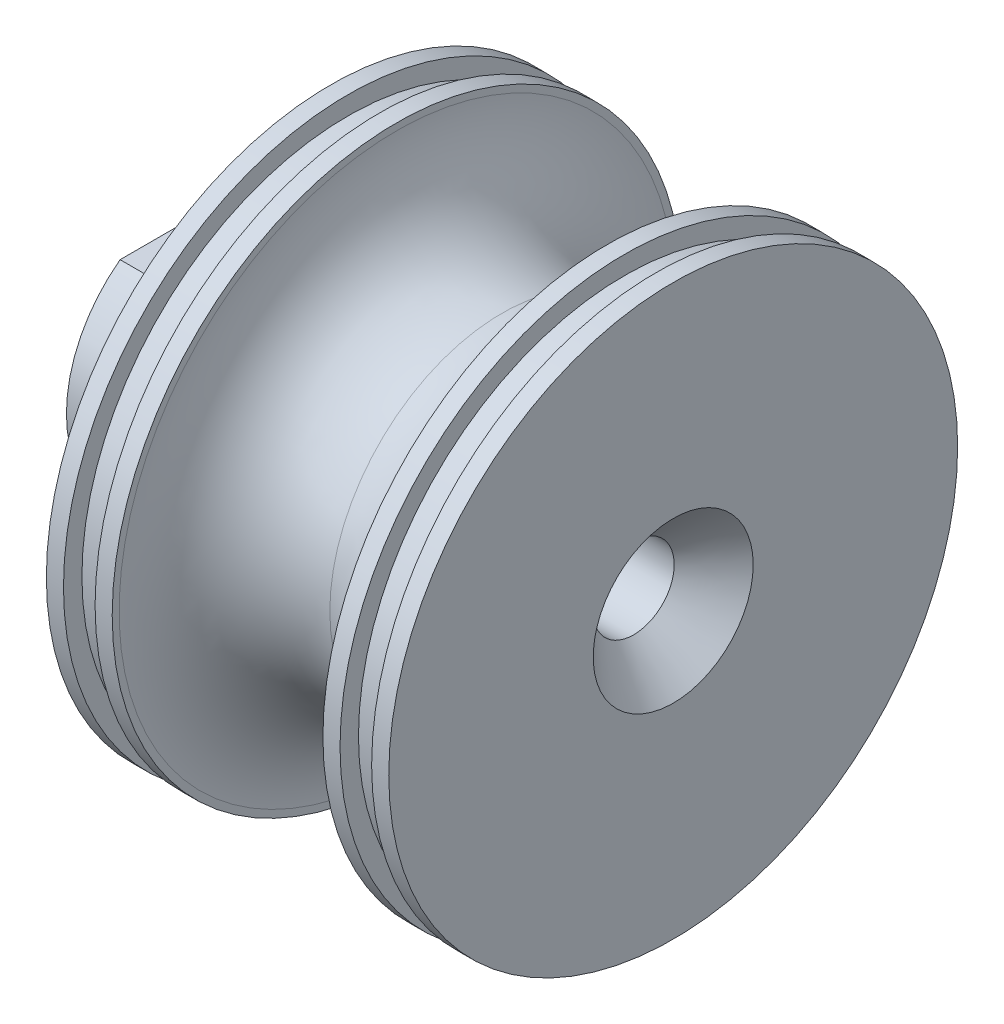
ISO-10303-21;
HEADER;
FILE_DESCRIPTION(('STEP AP214'),'2;1');
FILE_NAME('part.step','',(''),(''),'','','');
FILE_SCHEMA(('AUTOMOTIVE_DESIGN { 1 0 10303 214 1 1 1 1 }'));
ENDSEC;
DATA;
#1=APPLICATION_CONTEXT('core data for automotive mechanical design processes');
#2=APPLICATION_PROTOCOL_DEFINITION('international standard','automotive_design',2000,#1);
#3=PRODUCT_CONTEXT('',#1,'mechanical');
#4=PRODUCT('Part','Part','',(#3));
#5=PRODUCT_RELATED_PRODUCT_CATEGORY('part','',(#4));
#6=PRODUCT_DEFINITION_FORMATION('','',#4);
#7=PRODUCT_DEFINITION_CONTEXT('part definition',#1,'design');
#8=PRODUCT_DEFINITION('design','',#6,#7);
#9=PRODUCT_DEFINITION_SHAPE('','',#8);
#10=(LENGTH_UNIT() NAMED_UNIT(*) SI_UNIT(.MILLI.,.METRE.));
#11=(NAMED_UNIT(*) PLANE_ANGLE_UNIT() SI_UNIT($,.RADIAN.));
#12=(NAMED_UNIT(*) SI_UNIT($,.STERADIAN.) SOLID_ANGLE_UNIT());
#13=UNCERTAINTY_MEASURE_WITH_UNIT(LENGTH_MEASURE(1.E-05),#10,'distance_accuracy_value','');
#14=(GEOMETRIC_REPRESENTATION_CONTEXT(3) GLOBAL_UNCERTAINTY_ASSIGNED_CONTEXT((#13)) GLOBAL_UNIT_ASSIGNED_CONTEXT((#10,
#11,#12)) REPRESENTATION_CONTEXT('',''));
#15=CARTESIAN_POINT('',(0.,0.,0.));
#16=DIRECTION('',(0.,0.,1.));
#17=DIRECTION('',(1.,0.,0.));
#18=AXIS2_PLACEMENT_3D('',#15,#16,#17);
#19=CARTESIAN_POINT('',(5.,21.6,0.));
#20=DIRECTION('',(1.,0.,0.));
#21=DIRECTION('',(0.,0.,-1.));
#22=AXIS2_PLACEMENT_3D('',#19,#20,#21);
#23=PLANE('',#22);
#24=CARTESIAN_POINT('',(5.,0.,0.));
#25=DIRECTION('',(1.,0.,0.));
#26=DIRECTION('',(0.,0.,-1.));
#27=AXIS2_PLACEMENT_3D('',#24,#25,#26);
#28=CIRCLE('',#27,21.075);
#29=CARTESIAN_POINT('',(5.,0.,-21.075));
#30=VERTEX_POINT('',#29);
#31=EDGE_CURVE('E106',#30,#30,#28,.F.);
#32=ORIENTED_EDGE('',*,*,#31,.T.);
#33=EDGE_LOOP('',(#32));
#34=FACE_BOUND('',#33,.T.);
#35=CARTESIAN_POINT('',(5.,0.,0.));
#36=DIRECTION('',(-1.,0.,0.));
#37=DIRECTION('',(0.,0.,1.));
#38=AXIS2_PLACEMENT_3D('',#35,#36,#37);
#39=CIRCLE('',#38,21.6);
#40=CARTESIAN_POINT('',(5.,0.,21.6));
#41=VERTEX_POINT('',#40);
#42=EDGE_CURVE('E103',#41,#41,#39,.T.);
#43=ORIENTED_EDGE('',*,*,#42,.F.);
#44=EDGE_LOOP('',(#43));
#45=FACE_BOUND('',#44,.T.);
#46=ADVANCED_FACE('F37',(#34,#45),#23,.T.);
#47=CARTESIAN_POINT('',(0.,0.,0.));
#48=DIRECTION('',(-1.,0.,0.));
#49=DIRECTION('',(0.,0.,1.));
#50=AXIS2_PLACEMENT_3D('',#47,#48,#49);
#51=CYLINDRICAL_SURFACE('',#50,21.6);
#52=ORIENTED_EDGE('',*,*,#42,.T.);
#53=EDGE_LOOP('',(#52));
#54=FACE_BOUND('',#53,.T.);
#55=CARTESIAN_POINT('',(3.7,0.,0.));
#56=DIRECTION('',(-1.,0.,0.));
#57=DIRECTION('',(0.,0.,1.));
#58=AXIS2_PLACEMENT_3D('',#55,#56,#57);
#59=CIRCLE('',#58,21.6);
#60=CARTESIAN_POINT('',(3.7,0.,21.6));
#61=VERTEX_POINT('',#60);
#62=EDGE_CURVE('E100',#61,#61,#59,.T.);
#63=ORIENTED_EDGE('',*,*,#62,.F.);
#64=EDGE_LOOP('',(#63));
#65=FACE_BOUND('',#64,.T.);
#66=ADVANCED_FACE('F130',(#54,#65),#51,.T.);
#67=CARTESIAN_POINT('',(3.7,20.2,0.));
#68=DIRECTION('',(-1.,0.,0.));
#69=DIRECTION('',(0.,0.,1.));
#70=AXIS2_PLACEMENT_3D('',#67,#68,#69);
#71=PLANE('',#70);
#72=ORIENTED_EDGE('',*,*,#62,.T.);
#73=EDGE_LOOP('',(#72));
#74=FACE_BOUND('',#73,.T.);
#75=CARTESIAN_POINT('',(3.7,0.,0.));
#76=DIRECTION('',(-1.,0.,0.));
#77=DIRECTION('',(0.,0.,1.));
#78=AXIS2_PLACEMENT_3D('',#75,#76,#77);
#79=CIRCLE('',#78,20.2);
#80=CARTESIAN_POINT('',(3.7,0.,20.2));
#81=VERTEX_POINT('',#80);
#82=EDGE_CURVE('E97',#81,#81,#79,.T.);
#83=ORIENTED_EDGE('',*,*,#82,.F.);
#84=EDGE_LOOP('',(#83));
#85=FACE_BOUND('',#84,.T.);
#86=ADVANCED_FACE('F136',(#74,#85),#71,.T.);
#87=CARTESIAN_POINT('',(0.,0.,0.));
#88=DIRECTION('',(-1.,0.,0.));
#89=DIRECTION('',(0.,0.,1.));
#90=AXIS2_PLACEMENT_3D('',#87,#88,#89);
#91=CYLINDRICAL_SURFACE('',#90,20.2);
#92=ORIENTED_EDGE('',*,*,#82,.T.);
#93=EDGE_LOOP('',(#92));
#94=FACE_BOUND('',#93,.T.);
#95=CARTESIAN_POINT('',(1.3,0.,0.));
#96=DIRECTION('',(-1.,0.,0.));
#97=DIRECTION('',(0.,0.,1.));
#98=AXIS2_PLACEMENT_3D('',#95,#96,#97);
#99=CIRCLE('',#98,20.2);
#100=CARTESIAN_POINT('',(1.3,0.,20.2));
#101=VERTEX_POINT('',#100);
#102=EDGE_CURVE('E94',#101,#101,#99,.T.);
#103=ORIENTED_EDGE('',*,*,#102,.F.);
#104=EDGE_LOOP('',(#103));
#105=FACE_BOUND('',#104,.T.);
#106=ADVANCED_FACE('F214',(#94,#105),#91,.T.);
#107=CARTESIAN_POINT('',(1.3,21.6,0.));
#108=DIRECTION('',(1.,0.,0.));
#109=DIRECTION('',(0.,0.,-1.));
#110=AXIS2_PLACEMENT_3D('',#107,#108,#109);
#111=PLANE('',#110);
#112=ORIENTED_EDGE('',*,*,#102,.T.);
#113=EDGE_LOOP('',(#112));
#114=FACE_BOUND('',#113,.T.);
#115=CARTESIAN_POINT('',(1.3,0.,0.));
#116=DIRECTION('',(-1.,0.,0.));
#117=DIRECTION('',(0.,0.,1.));
#118=AXIS2_PLACEMENT_3D('',#115,#116,#117);
#119=CIRCLE('',#118,21.6);
#120=CARTESIAN_POINT('',(1.3,0.,21.6));
#121=VERTEX_POINT('',#120);
#122=EDGE_CURVE('E91',#121,#121,#119,.T.);
#123=ORIENTED_EDGE('',*,*,#122,.F.);
#124=EDGE_LOOP('',(#123));
#125=FACE_BOUND('',#124,.T.);
#126=ADVANCED_FACE('F210',(#114,#125),#111,.T.);
#127=CARTESIAN_POINT('',(0.,0.,0.));
#128=DIRECTION('',(-1.,0.,0.));
#129=DIRECTION('',(0.,0.,1.));
#130=AXIS2_PLACEMENT_3D('',#127,#128,#129);
#131=CYLINDRICAL_SURFACE('',#130,21.6);
#132=ORIENTED_EDGE('',*,*,#122,.T.);
#133=EDGE_LOOP('',(#132));
#134=FACE_BOUND('',#133,.T.);
#135=CARTESIAN_POINT('',(0.,0.,0.));
#136=DIRECTION('',(-1.,0.,0.));
#137=DIRECTION('',(0.,0.,1.));
#138=AXIS2_PLACEMENT_3D('',#135,#136,#137);
#139=CIRCLE('',#138,21.6);
#140=CARTESIAN_POINT('',(0.,0.,21.6));
#141=VERTEX_POINT('',#140);
#142=EDGE_CURVE('E82',#141,#141,#139,.T.);
#143=ORIENTED_EDGE('',*,*,#142,.F.);
#144=EDGE_LOOP('',(#143));
#145=FACE_BOUND('',#144,.T.);
#146=ADVANCED_FACE('F206',(#134,#145),#131,.T.);
#147=CARTESIAN_POINT('',(0.,10.075,0.));
#148=DIRECTION('',(-1.,0.,0.));
#149=DIRECTION('',(0.,0.,1.));
#150=AXIS2_PLACEMENT_3D('',#147,#148,#149);
#151=PLANE('',#150);
#152=CARTESIAN_POINT('',(0.,0.,0.));
#153=DIRECTION('',(-1.,0.,0.));
#154=DIRECTION('',(0.,0.,1.));
#155=AXIS2_PLACEMENT_3D('',#152,#153,#154);
#156=CIRCLE('',#155,10.075);
#157=CARTESIAN_POINT('',(0.,8.09355453431927,-6.));
#158=VERTEX_POINT('',#157);
#159=CARTESIAN_POINT('',(0.,8.09355453431927,6.));
#160=VERTEX_POINT('',#159);
#161=EDGE_CURVE('E75',#158,#160,#156,.T.);
#162=ORIENTED_EDGE('',*,*,#161,.F.);
#163=DIRECTION('',(0.,0.,1.));
#164=VECTOR('',#163,1.);
#165=CARTESIAN_POINT('',(0.,8.09355453431927,-6.));
#166=LINE('',#165,#164);
#167=EDGE_CURVE('E67',#158,#160,#166,.T.);
#168=ORIENTED_EDGE('',*,*,#167,.T.);
#169=EDGE_LOOP('',(#162,#168));
#170=FACE_BOUND('',#169,.T.);
#171=ORIENTED_EDGE('',*,*,#142,.T.);
#172=EDGE_LOOP('',(#171));
#173=FACE_BOUND('',#172,.T.);
#174=ADVANCED_FACE('F203',(#170,#173),#151,.T.);
#175=CARTESIAN_POINT('',(0.,0.,0.));
#176=DIRECTION('',(-1.,0.,0.));
#177=DIRECTION('',(0.,0.,1.));
#178=AXIS2_PLACEMENT_3D('',#175,#176,#177);
#179=CYLINDRICAL_SURFACE('',#178,10.075);
#180=DIRECTION('',(-1.,0.,0.));
#181=VECTOR('',#180,1.);
#182=CARTESIAN_POINT('',(0.,8.09355453431927,6.));
#183=LINE('',#182,#181);
#184=CARTESIAN_POINT('',(-10.,8.09355453431927,6.));
#185=VERTEX_POINT('',#184);
#186=EDGE_CURVE('E58',#160,#185,#183,.T.);
#187=ORIENTED_EDGE('',*,*,#186,.T.);
#188=CARTESIAN_POINT('',(-10.,0.,0.));
#189=DIRECTION('',(-1.,0.,0.));
#190=DIRECTION('',(0.,0.,1.));
#191=AXIS2_PLACEMENT_3D('',#188,#189,#190);
#192=CIRCLE('',#191,10.075);
#193=CARTESIAN_POINT('',(-10.,8.09355453431927,-6.));
#194=VERTEX_POINT('',#193);
#195=EDGE_CURVE('E73',#194,#185,#192,.T.);
#196=ORIENTED_EDGE('',*,*,#195,.F.);
#197=DIRECTION('',(-1.,0.,0.));
#198=VECTOR('',#197,1.);
#199=CARTESIAN_POINT('',(0.,8.09355453431927,-6.));
#200=LINE('',#199,#198);
#201=EDGE_CURVE('E52',#158,#194,#200,.T.);
#202=ORIENTED_EDGE('',*,*,#201,.F.);
#203=ORIENTED_EDGE('',*,*,#161,.T.);
#204=EDGE_LOOP('',(#187,#196,#202,#203));
#205=FACE_BOUND('',#204,.T.);
#206=ADVANCED_FACE('F72',(#205),#179,.T.);
#207=CARTESIAN_POINT('',(-10.,3.075,0.));
#208=DIRECTION('',(-1.,0.,0.));
#209=DIRECTION('',(0.,0.,1.));
#210=AXIS2_PLACEMENT_3D('',#207,#208,#209);
#211=PLANE('',#210);
#212=DIRECTION('',(0.,0.,1.));
#213=VECTOR('',#212,1.);
#214=CARTESIAN_POINT('',(-10.,8.09355453431927,-6.));
#215=LINE('',#214,#213);
#216=EDGE_CURVE('E62',#194,#185,#215,.T.);
#217=ORIENTED_EDGE('',*,*,#216,.F.);
#218=ORIENTED_EDGE('',*,*,#195,.T.);
#219=EDGE_LOOP('',(#217,#218));
#220=FACE_BOUND('',#219,.T.);
#221=CARTESIAN_POINT('',(-10.,0.,0.));
#222=DIRECTION('',(-1.,0.,0.));
#223=DIRECTION('',(0.,0.,1.));
#224=AXIS2_PLACEMENT_3D('',#221,#222,#223);
#225=CIRCLE('',#224,3.075);
#226=CARTESIAN_POINT('',(-10.,0.,3.075));
#227=VERTEX_POINT('',#226);
#228=EDGE_CURVE('E80',#227,#227,#225,.T.);
#229=ORIENTED_EDGE('',*,*,#228,.F.);
#230=EDGE_LOOP('',(#229));
#231=FACE_BOUND('',#230,.T.);
#232=ADVANCED_FACE('F78',(#220,#231),#211,.T.);
#233=CARTESIAN_POINT('',(0.,0.,0.));
#234=DIRECTION('',(-1.,0.,0.));
#235=DIRECTION('',(0.,0.,1.));
#236=AXIS2_PLACEMENT_3D('',#233,#234,#235);
#237=CYLINDRICAL_SURFACE('',#236,3.075);
#238=CARTESIAN_POINT('',(23.,0.,0.));
#239=DIRECTION('',(1.,0.,0.));
#240=DIRECTION('',(0.,0.,-1.));
#241=AXIS2_PLACEMENT_3D('',#238,#239,#240);
#242=CIRCLE('',#241,3.075);
#243=CARTESIAN_POINT('',(23.,0.,-3.075));
#244=VERTEX_POINT('',#243);
#245=EDGE_CURVE('E11',#244,#244,#242,.T.);
#246=ORIENTED_EDGE('',*,*,#245,.T.);
#247=EDGE_LOOP('',(#246));
#248=FACE_BOUND('',#247,.T.);
#249=CARTESIAN_POINT('',(-5.,2.68432952522599,1.5));
#250=CARTESIAN_POINT('',(-4.92154593724267,2.68433581421267,1.49999482092196));
#251=CARTESIAN_POINT('',(-4.84298621271024,2.68782072766942,1.49380427543983));
#252=CARTESIAN_POINT('',(-4.68825448204237,2.70126408599234,1.46934688816302));
#253=CARTESIAN_POINT('',(-4.61208812410977,2.71123679117979,1.45105344239717));
#254=CARTESIAN_POINT('',(-4.46467049780891,2.73622817770362,1.40335113751068));
#255=CARTESIAN_POINT('',(-4.39339625473787,2.75122100338213,1.37399913936051));
#256=CARTESIAN_POINT('',(-4.25680113830401,2.78452348984733,1.30518598355341));
#257=CARTESIAN_POINT('',(-4.19148033468088,2.80283318948098,1.26572470749518));
#258=CARTESIAN_POINT('',(-4.06299251336989,2.84246071762361,1.1741872023132));
#259=CARTESIAN_POINT('',(-4.0003945881856,2.8639018276007,1.1213651673705));
#260=CARTESIAN_POINT('',(-3.88450697969141,2.90637904731301,1.006158892536));
#261=CARTESIAN_POINT('',(-3.83122175284422,2.92741495888524,0.943770101268876));
#262=CARTESIAN_POINT('',(-3.73217036485334,2.96830806617656,0.806363720396625));
#263=CARTESIAN_POINT('',(-3.68709510885343,2.98800597264238,0.730796236100452));
#264=CARTESIAN_POINT('',(-3.61055512379449,3.02241782863225,0.572010637650771));
#265=CARTESIAN_POINT('',(-3.57908221042546,3.03713477396069,0.48879716062174));
#266=CARTESIAN_POINT('',(-3.53286398703445,3.05904046775184,0.323103219343339));
#267=CARTESIAN_POINT('',(-3.51712332738321,3.06667459350586,0.240960591472023));
#268=CARTESIAN_POINT('',(-3.49954804251717,3.0752102735664,0.0748721112081414));
#269=CARTESIAN_POINT('',(-3.49770546364891,3.07611567860978,-0.00907268224242028));
#270=CARTESIAN_POINT('',(-3.50757276778497,3.07131120901399,-0.168938531677514));
#271=CARTESIAN_POINT('',(-3.51817224856664,3.06614330697699,-0.24494804543936));
#272=CARTESIAN_POINT('',(-3.55064881815393,3.05058048434538,-0.39394949043979));
#273=CARTESIAN_POINT('',(-3.57252674787272,3.04018517400031,-0.466941196234341));
#274=CARTESIAN_POINT('',(-3.62710679735744,3.01494093665191,-0.609139189583257));
#275=CARTESIAN_POINT('',(-3.6599593866662,3.00003038450307,-0.67827632889605));
#276=CARTESIAN_POINT('',(-3.73536151205659,2.96711744521806,-0.810228553016931));
#277=CARTESIAN_POINT('',(-3.7779145666768,2.94911393679455,-0.873041331914602));
#278=CARTESIAN_POINT('',(-3.87597175351332,2.90978817900965,-0.996663951046771));
#279=CARTESIAN_POINT('',(-3.93230256530703,2.88831300729677,-1.05677004486091));
#280=CARTESIAN_POINT('',(-4.05408936899801,2.84554411081666,-1.16705156797177));
#281=CARTESIAN_POINT('',(-4.11955174149269,2.82425052406626,-1.21721999357468));
#282=CARTESIAN_POINT('',(-4.26242876514238,2.78292995873392,-1.30904909433283));
#283=CARTESIAN_POINT('',(-4.34031740934326,2.76304891594782,-1.35004433076573));
#284=CARTESIAN_POINT('',(-4.5030910152575,2.72878174507238,-1.41804092123732));
#285=CARTESIAN_POINT('',(-4.58796887952507,2.71439012422453,-1.44505627336569));
#286=CARTESIAN_POINT('',(-4.75533722139156,2.69427886685333,-1.48219528259122));
#287=CARTESIAN_POINT('',(-4.83749908438327,2.68797130291771,-1.49347029854283));
#288=CARTESIAN_POINT('',(-5.00276437702118,2.68306358242714,-1.50227405826886));
#289=CARTESIAN_POINT('',(-5.08586717845879,2.68445855494568,-1.49981148940076));
#290=CARTESIAN_POINT('',(-5.24166619988532,2.69417646477654,-1.4822665866842));
#291=CARTESIAN_POINT('',(-5.31456164039364,2.70178083808621,-1.46849235601829));
#292=CARTESIAN_POINT('',(-5.45688146986954,2.72202082431555,-1.43062397991745));
#293=CARTESIAN_POINT('',(-5.52630479214905,2.73465797282353,-1.40652668456378));
#294=CARTESIAN_POINT('',(-5.66336383592317,2.76423294867178,-1.34750678069053));
#295=CARTESIAN_POINT('',(-5.73076689068551,2.78134321765249,-1.3121334906417));
#296=CARTESIAN_POINT('',(-5.85906335673253,2.81776923064552,-1.23196552280861));
#297=CARTESIAN_POINT('',(-5.91995343097463,2.83708609486429,-1.18716604989805));
#298=CARTESIAN_POINT('',(-6.04105812729412,2.87850879285747,-1.08318925156346));
#299=CARTESIAN_POINT('',(-6.10033324242773,2.90067334131813,-1.02293613786954));
#300=CARTESIAN_POINT('',(-6.20820666817751,2.94328563528926,-0.892956208098345));
#301=CARTESIAN_POINT('',(-6.25680191003748,2.96373288631122,-0.823226678356763));
#302=CARTESIAN_POINT('',(-6.34279220162212,3.00119701734201,-0.674142213438682));
#303=CARTESIAN_POINT('',(-6.37992095572339,3.01812971036064,-0.594611059289631));
#304=CARTESIAN_POINT('',(-6.43991309742788,3.04602431969871,-0.429369379355462));
#305=CARTESIAN_POINT('',(-6.46278840809822,3.05699122544724,-0.343664085406642));
#306=CARTESIAN_POINT('',(-6.49174251989063,3.07095712625441,-0.176728334439845));
#307=CARTESIAN_POINT('',(-6.49913293912625,3.07457741508582,-0.0957767326059156));
#308=CARTESIAN_POINT('',(-6.50072200505949,3.07535182739739,0.0662755877736264));
#309=CARTESIAN_POINT('',(-6.49492482953773,3.07250799868602,0.147376250964173));
#310=CARTESIAN_POINT('',(-6.4711936269161,3.0610356471871,0.302250748754675));
#311=CARTESIAN_POINT('',(-6.45401827407434,3.05276902351132,0.376170387876943));
#312=CARTESIAN_POINT('',(-6.4090093059274,3.0315901805737,0.519973058823054));
#313=CARTESIAN_POINT('',(-6.38117408937993,3.01867726339919,0.589855482391771));
#314=CARTESIAN_POINT('',(-6.3143400454388,2.98867613584177,0.727040316046041));
#315=CARTESIAN_POINT('',(-6.27490399528928,2.97142924235557,0.794094000454217));
#316=CARTESIAN_POINT('',(-6.18654581845151,2.93460455263714,0.920917608827313));
#317=CARTESIAN_POINT('',(-6.13761932592472,2.91502568524522,0.980684159843556));
#318=CARTESIAN_POINT('',(-6.02625654533975,2.87331057357741,1.09722218832654));
#319=CARTESIAN_POINT('',(-5.96297764831526,2.85110828296759,1.15316721351865));
#320=CARTESIAN_POINT('',(-5.82753170619396,2.80825773803196,1.25392153696642));
#321=CARTESIAN_POINT('',(-5.75535749951589,2.78761075771183,1.29872177385159));
#322=CARTESIAN_POINT('',(-5.60175166784496,2.7499195889502,1.37677052629848));
#323=CARTESIAN_POINT('',(-5.52013688471015,2.73297579953048,1.40970991609026));
#324=CARTESIAN_POINT('',(-5.35148488390472,2.70597851473422,1.46087814254945));
#325=CARTESIAN_POINT('',(-5.26446691904133,2.69590193215382,1.47915630657565));
#326=CARTESIAN_POINT('',(-5.1471544728505,2.68819901583016,1.49305693952807));
#327=CARTESIAN_POINT('',(-5.11780823815711,2.68675249959287,1.49565695970641));
#328=CARTESIAN_POINT('',(-5.05897965338259,2.6848165423838,1.49912951705159));
#329=CARTESIAN_POINT('',(-5.0294972949854,2.68432716068184,1.50000194723877));
#330=CARTESIAN_POINT('',(-5.,2.68432952522599,1.5));
#331=B_SPLINE_CURVE_WITH_KNOTS('',3,(#249,#250,#251,#252,#253,#254,#255,#256,#257,#258,#259,
#260,#261,#262,#263,#264,#265,#266,#267,#268,#269,#270,#271,#272,#273,#274,#275,#276,#277,#278,
#279,#280,#281,#282,#283,#284,#285,#286,#287,#288,#289,#290,#291,#292,#293,#294,#295,#296,#297,
#298,#299,#300,#301,#302,#303,#304,#305,#306,#307,#308,#309,#310,#311,#312,#313,#314,#315,#316,
#317,#318,#319,#320,#321,#322,#323,#324,#325,#326,#327,#328,#329,#330),.UNSPECIFIED.,.T.,.F.,(4,
2,2,2,2,2,2,2,2,2,2,2,2,2,2,2,2,2,2,2,2,2,2,2,2,2,2,2,2,2,2,2,2,2,2,2,2,2,2,2,4),(0.,
0.235238167905976,0.470995149919062,0.705556101492391,0.940119800402731,1.19304938995252,
1.44609968600457,1.71519360501769,1.98412538839189,2.23469622791995,2.48512365880203,
2.71479885846978,2.94449118503528,3.1774716579523,3.41053677204695,3.66483381066491,
3.91930943554891,4.18860184043779,4.45762407792861,4.70570144446448,4.9536219499227,
5.1763439997176,5.39913405805874,5.63226851462186,5.86552185532914,6.12648407268987,
6.38752117721369,6.65423001249174,6.92071544409881,7.16352713381956,7.40626191241904,
7.63425120184688,7.86227475150401,8.10032905715674,8.33849313451864,8.59932470925944,
8.86036766738198,9.12779131154154,9.39431139599791,9.48275117516772,9.57119643073097),.UNSPECIFIED.);
#332=CARTESIAN_POINT('',(-5.,2.68432952522599,1.5));
#333=VERTEX_POINT('',#332);
#334=EDGE_CURVE('E354',#333,#333,#331,.T.);
#335=ORIENTED_EDGE('',*,*,#334,.T.);
#336=EDGE_LOOP('',(#335));
#337=FACE_BOUND('',#336,.T.);
#338=ORIENTED_EDGE('',*,*,#228,.T.);
#339=EDGE_LOOP('',(#338));
#340=FACE_BOUND('',#339,.T.);
#341=ADVANCED_FACE('F187',(#248,#337,#340),#237,.F.);
#342=CARTESIAN_POINT('',(26.,21.6,0.));
#343=DIRECTION('',(1.,0.,0.));
#344=DIRECTION('',(0.,0.,-1.));
#345=AXIS2_PLACEMENT_3D('',#342,#343,#344);
#346=PLANE('',#345);
#347=CARTESIAN_POINT('',(26.,0.,0.));
#348=DIRECTION('',(1.,0.,0.));
#349=DIRECTION('',(0.,0.,-1.));
#350=AXIS2_PLACEMENT_3D('',#347,#348,#349);
#351=CIRCLE('',#350,6.075);
#352=CARTESIAN_POINT('',(26.,0.,-6.075));
#353=VERTEX_POINT('',#352);
#354=EDGE_CURVE('E45',#353,#353,#351,.F.);
#355=ORIENTED_EDGE('',*,*,#354,.T.);
#356=EDGE_LOOP('',(#355));
#357=FACE_BOUND('',#356,.T.);
#358=CARTESIAN_POINT('',(26.,0.,0.));
#359=DIRECTION('',(-1.,0.,0.));
#360=DIRECTION('',(0.,0.,1.));
#361=AXIS2_PLACEMENT_3D('',#358,#359,#360);
#362=CIRCLE('',#361,21.6);
#363=CARTESIAN_POINT('',(26.,0.,21.6));
#364=VERTEX_POINT('',#363);
#365=EDGE_CURVE('E85',#364,#364,#362,.T.);
#366=ORIENTED_EDGE('',*,*,#365,.F.);
#367=EDGE_LOOP('',(#366));
#368=FACE_BOUND('',#367,.T.);
#369=ADVANCED_FACE('F117',(#357,#368),#346,.T.);
#370=CARTESIAN_POINT('',(0.,0.,0.));
#371=DIRECTION('',(-1.,0.,0.));
#372=DIRECTION('',(0.,0.,1.));
#373=AXIS2_PLACEMENT_3D('',#370,#371,#372);
#374=CYLINDRICAL_SURFACE('',#373,21.6);
#375=ORIENTED_EDGE('',*,*,#365,.T.);
#376=EDGE_LOOP('',(#375));
#377=FACE_BOUND('',#376,.T.);
#378=CARTESIAN_POINT('',(24.7,0.,0.));
#379=DIRECTION('',(-1.,0.,0.));
#380=DIRECTION('',(0.,0.,1.));
#381=AXIS2_PLACEMENT_3D('',#378,#379,#380);
#382=CIRCLE('',#381,21.6);
#383=CARTESIAN_POINT('',(24.7,0.,21.6));
#384=VERTEX_POINT('',#383);
#385=EDGE_CURVE('E179',#384,#384,#382,.T.);
#386=ORIENTED_EDGE('',*,*,#385,.F.);
#387=EDGE_LOOP('',(#386));
#388=FACE_BOUND('',#387,.T.);
#389=ADVANCED_FACE('F184',(#377,#388),#374,.T.);
#390=CARTESIAN_POINT('',(24.7,20.2,0.));
#391=DIRECTION('',(-1.,0.,0.));
#392=DIRECTION('',(0.,0.,1.));
#393=AXIS2_PLACEMENT_3D('',#390,#391,#392);
#394=PLANE('',#393);
#395=ORIENTED_EDGE('',*,*,#385,.T.);
#396=EDGE_LOOP('',(#395));
#397=FACE_BOUND('',#396,.T.);
#398=CARTESIAN_POINT('',(24.7,0.,0.));
#399=DIRECTION('',(-1.,0.,0.));
#400=DIRECTION('',(0.,0.,1.));
#401=AXIS2_PLACEMENT_3D('',#398,#399,#400);
#402=CIRCLE('',#401,20.2);
#403=CARTESIAN_POINT('',(24.7,0.,20.2));
#404=VERTEX_POINT('',#403);
#405=EDGE_CURVE('E176',#404,#404,#402,.T.);
#406=ORIENTED_EDGE('',*,*,#405,.F.);
#407=EDGE_LOOP('',(#406));
#408=FACE_BOUND('',#407,.T.);
#409=ADVANCED_FACE('F193',(#397,#408),#394,.T.);
#410=CARTESIAN_POINT('',(0.,0.,0.));
#411=DIRECTION('',(-1.,0.,0.));
#412=DIRECTION('',(0.,0.,1.));
#413=AXIS2_PLACEMENT_3D('',#410,#411,#412);
#414=CYLINDRICAL_SURFACE('',#413,20.2);
#415=ORIENTED_EDGE('',*,*,#405,.T.);
#416=EDGE_LOOP('',(#415));
#417=FACE_BOUND('',#416,.T.);
#418=CARTESIAN_POINT('',(22.3,0.,0.));
#419=DIRECTION('',(-1.,0.,0.));
#420=DIRECTION('',(0.,0.,1.));
#421=AXIS2_PLACEMENT_3D('',#418,#419,#420);
#422=CIRCLE('',#421,20.2);
#423=CARTESIAN_POINT('',(22.3,0.,20.2));
#424=VERTEX_POINT('',#423);
#425=EDGE_CURVE('E170',#424,#424,#422,.T.);
#426=ORIENTED_EDGE('',*,*,#425,.F.);
#427=EDGE_LOOP('',(#426));
#428=FACE_BOUND('',#427,.T.);
#429=ADVANCED_FACE('F321',(#417,#428),#414,.T.);
#430=CARTESIAN_POINT('',(22.3,21.6,0.));
#431=DIRECTION('',(1.,0.,0.));
#432=DIRECTION('',(0.,0.,-1.));
#433=AXIS2_PLACEMENT_3D('',#430,#431,#432);
#434=PLANE('',#433);
#435=ORIENTED_EDGE('',*,*,#425,.T.);
#436=EDGE_LOOP('',(#435));
#437=FACE_BOUND('',#436,.T.);
#438=CARTESIAN_POINT('',(22.3,0.,0.));
#439=DIRECTION('',(-1.,0.,0.));
#440=DIRECTION('',(0.,0.,1.));
#441=AXIS2_PLACEMENT_3D('',#438,#439,#440);
#442=CIRCLE('',#441,21.6);
#443=CARTESIAN_POINT('',(22.3,0.,21.6));
#444=VERTEX_POINT('',#443);
#445=EDGE_CURVE('E167',#444,#444,#442,.T.);
#446=ORIENTED_EDGE('',*,*,#445,.F.);
#447=EDGE_LOOP('',(#446));
#448=FACE_BOUND('',#447,.T.);
#449=ADVANCED_FACE('F312',(#437,#448),#434,.T.);
#450=CARTESIAN_POINT('',(0.,0.,0.));
#451=DIRECTION('',(-1.,0.,0.));
#452=DIRECTION('',(0.,0.,1.));
#453=AXIS2_PLACEMENT_3D('',#450,#451,#452);
#454=CYLINDRICAL_SURFACE('',#453,21.6);
#455=ORIENTED_EDGE('',*,*,#445,.T.);
#456=EDGE_LOOP('',(#455));
#457=FACE_BOUND('',#456,.T.);
#458=CARTESIAN_POINT('',(21.,0.,0.));
#459=DIRECTION('',(-1.,0.,0.));
#460=DIRECTION('',(0.,0.,1.));
#461=AXIS2_PLACEMENT_3D('',#458,#459,#460);
#462=CIRCLE('',#461,21.6);
#463=CARTESIAN_POINT('',(21.,0.,21.6));
#464=VERTEX_POINT('',#463);
#465=EDGE_CURVE('E76',#464,#464,#462,.T.);
#466=ORIENTED_EDGE('',*,*,#465,.F.);
#467=EDGE_LOOP('',(#466));
#468=FACE_BOUND('',#467,.T.);
#469=ADVANCED_FACE('F162',(#457,#468),#454,.T.);
#470=CARTESIAN_POINT('',(21.,13.075,0.));
#471=DIRECTION('',(-1.,0.,0.));
#472=DIRECTION('',(0.,0.,1.));
#473=AXIS2_PLACEMENT_3D('',#470,#471,#472);
#474=PLANE('',#473);
#475=CARTESIAN_POINT('',(21.,0.,0.));
#476=DIRECTION('',(-1.,0.,0.));
#477=DIRECTION('',(0.,0.,1.));
#478=AXIS2_PLACEMENT_3D('',#475,#476,#477);
#479=CIRCLE('',#478,21.075);
#480=CARTESIAN_POINT('',(21.,0.,21.075));
#481=VERTEX_POINT('',#480);
#482=EDGE_CURVE('E112',#481,#481,#479,.F.);
#483=ORIENTED_EDGE('',*,*,#482,.T.);
#484=EDGE_LOOP('',(#483));
#485=FACE_BOUND('',#484,.T.);
#486=ORIENTED_EDGE('',*,*,#465,.T.);
#487=EDGE_LOOP('',(#486));
#488=FACE_BOUND('',#487,.T.);
#489=ADVANCED_FACE('F145',(#485,#488),#474,.T.);
#490=CARTESIAN_POINT('',(13.,0.,0.));
#491=DIRECTION('',(1.,0.,0.));
#492=DIRECTION('',(0.,0.,-1.));
#493=AXIS2_PLACEMENT_3D('',#490,#491,#492);
#494=TOROIDAL_SURFACE('',#493,21.075,8.);
#495=CARTESIAN_POINT('',(13.,0.,0.));
#496=DIRECTION('',(1.,0.,0.));
#497=DIRECTION('',(0.,0.,-1.));
#498=AXIS2_PLACEMENT_3D('',#495,#496,#497);
#499=CIRCLE('',#498,13.075);
#500=CARTESIAN_POINT('',(13.,0.,-13.075));
#501=VERTEX_POINT('',#500);
#502=EDGE_CURVE('E109',#501,#501,#499,.T.);
#503=ORIENTED_EDGE('',*,*,#502,.F.);
#504=EDGE_LOOP('',(#503));
#505=FACE_BOUND('',#504,.T.);
#506=ORIENTED_EDGE('',*,*,#31,.F.);
#507=EDGE_LOOP('',(#506));
#508=FACE_BOUND('',#507,.T.);
#509=ADVANCED_FACE('F142',(#505,#508),#494,.F.);
#510=CARTESIAN_POINT('',(13.,0.,0.));
#511=DIRECTION('',(-1.,0.,0.));
#512=DIRECTION('',(0.,0.,1.));
#513=AXIS2_PLACEMENT_3D('',#510,#511,#512);
#514=TOROIDAL_SURFACE('',#513,21.075,8.);
#515=ORIENTED_EDGE('',*,*,#482,.F.);
#516=EDGE_LOOP('',(#515));
#517=FACE_BOUND('',#516,.T.);
#518=ORIENTED_EDGE('',*,*,#502,.T.);
#519=EDGE_LOOP('',(#518));
#520=FACE_BOUND('',#519,.T.);
#521=ADVANCED_FACE('F144',(#517,#520),#514,.F.);
#522=CARTESIAN_POINT('',(0.,8.09355453431927,-6.));
#523=DIRECTION('',(0.,-1.,0.));
#524=DIRECTION('',(0.,0.,-1.));
#525=AXIS2_PLACEMENT_3D('',#522,#523,#524);
#526=PLANE('',#525);
#527=CARTESIAN_POINT('',(-5.,8.09355453431927,0.));
#528=DIRECTION('',(0.,1.,0.));
#529=DIRECTION('',(0.,0.,1.));
#530=AXIS2_PLACEMENT_3D('',#527,#528,#529);
#531=CIRCLE('',#530,1.5);
#532=CARTESIAN_POINT('',(-5.,8.09355453431927,1.5));
#533=VERTEX_POINT('',#532);
#534=EDGE_CURVE('E68',#533,#533,#531,.T.);
#535=ORIENTED_EDGE('',*,*,#534,.F.);
#536=EDGE_LOOP('',(#535));
#537=FACE_BOUND('',#536,.T.);
#538=ORIENTED_EDGE('',*,*,#216,.T.);
#539=ORIENTED_EDGE('',*,*,#186,.F.);
#540=ORIENTED_EDGE('',*,*,#167,.F.);
#541=ORIENTED_EDGE('',*,*,#201,.T.);
#542=EDGE_LOOP('',(#538,#539,#540,#541));
#543=FACE_BOUND('',#542,.T.);
#544=ADVANCED_FACE('F63',(#537,#543),#526,.F.);
#545=CARTESIAN_POINT('',(-5.,-21.601,0.));
#546=DIRECTION('',(0.,1.,0.));
#547=DIRECTION('',(0.,0.,1.));
#548=AXIS2_PLACEMENT_3D('',#545,#546,#547);
#549=CYLINDRICAL_SURFACE('',#548,1.5);
#550=ORIENTED_EDGE('',*,*,#334,.F.);
#551=EDGE_LOOP('',(#550));
#552=FACE_BOUND('',#551,.T.);
#553=ORIENTED_EDGE('',*,*,#534,.T.);
#554=EDGE_LOOP('',(#553));
#555=FACE_BOUND('',#554,.T.);
#556=ADVANCED_FACE('F121',(#552,#555),#549,.F.);
#557=CARTESIAN_POINT('',(26.,0.,0.));
#558=DIRECTION('',(1.,0.,0.));
#559=DIRECTION('',(0.,0.,-1.));
#560=AXIS2_PLACEMENT_3D('',#557,#558,#559);
#561=CONICAL_SURFACE('',#560,6.075,0.785398163397447);
#562=CARTESIAN_POINT('',(23.,0.,-3.075));
#563=CARTESIAN_POINT('',(23.03125,0.,-3.10625));
#564=CARTESIAN_POINT('',(23.0625,0.,-3.1375));
#565=CARTESIAN_POINT('',(23.125,0.,-3.2));
#566=CARTESIAN_POINT('',(23.15625,0.,-3.23125));
#567=CARTESIAN_POINT('',(23.21875,0.,-3.29375));
#568=CARTESIAN_POINT('',(23.25,0.,-3.325));
#569=CARTESIAN_POINT('',(23.3125,0.,-3.3875));
#570=CARTESIAN_POINT('',(23.34375,0.,-3.41875));
#571=CARTESIAN_POINT('',(23.40625,0.,-3.48125));
#572=CARTESIAN_POINT('',(23.4375,0.,-3.5125));
#573=CARTESIAN_POINT('',(23.5,0.,-3.575));
#574=CARTESIAN_POINT('',(23.53125,0.,-3.60625));
#575=CARTESIAN_POINT('',(23.59375,0.,-3.66875));
#576=CARTESIAN_POINT('',(23.625,0.,-3.7));
#577=CARTESIAN_POINT('',(23.6875,0.,-3.7625));
#578=CARTESIAN_POINT('',(23.71875,0.,-3.79375));
#579=CARTESIAN_POINT('',(23.78125,0.,-3.85625));
#580=CARTESIAN_POINT('',(23.8125,0.,-3.8875));
#581=CARTESIAN_POINT('',(23.875,0.,-3.95));
#582=CARTESIAN_POINT('',(23.90625,0.,-3.98125));
#583=CARTESIAN_POINT('',(23.96875,0.,-4.04375));
#584=CARTESIAN_POINT('',(24.,0.,-4.075));
#585=CARTESIAN_POINT('',(24.0625,0.,-4.1375));
#586=CARTESIAN_POINT('',(24.09375,0.,-4.16875));
#587=CARTESIAN_POINT('',(24.15625,0.,-4.23125));
#588=CARTESIAN_POINT('',(24.1875,0.,-4.2625));
#589=CARTESIAN_POINT('',(24.25,0.,-4.325));
#590=CARTESIAN_POINT('',(24.28125,0.,-4.35625));
#591=CARTESIAN_POINT('',(24.34375,0.,-4.41875));
#592=CARTESIAN_POINT('',(24.375,0.,-4.45));
#593=CARTESIAN_POINT('',(24.4375,0.,-4.5125));
#594=CARTESIAN_POINT('',(24.46875,0.,-4.54375));
#595=CARTESIAN_POINT('',(24.53125,0.,-4.60625));
#596=CARTESIAN_POINT('',(24.5625,0.,-4.6375));
#597=CARTESIAN_POINT('',(24.625,0.,-4.7));
#598=CARTESIAN_POINT('',(24.65625,0.,-4.73125));
#599=CARTESIAN_POINT('',(24.71875,0.,-4.79375));
#600=CARTESIAN_POINT('',(24.75,0.,-4.825));
#601=CARTESIAN_POINT('',(24.8125,0.,-4.8875));
#602=CARTESIAN_POINT('',(24.84375,0.,-4.91875));
#603=CARTESIAN_POINT('',(24.90625,0.,-4.98125));
#604=CARTESIAN_POINT('',(24.9375,0.,-5.0125));
#605=CARTESIAN_POINT('',(25.,0.,-5.075));
#606=CARTESIAN_POINT('',(25.03125,0.,-5.10625));
#607=CARTESIAN_POINT('',(25.09375,0.,-5.16875));
#608=CARTESIAN_POINT('',(25.125,0.,-5.2));
#609=CARTESIAN_POINT('',(25.1875,0.,-5.2625));
#610=CARTESIAN_POINT('',(25.21875,0.,-5.29375));
#611=CARTESIAN_POINT('',(25.28125,0.,-5.35625));
#612=CARTESIAN_POINT('',(25.3125,0.,-5.3875));
#613=CARTESIAN_POINT('',(25.375,0.,-5.45));
#614=CARTESIAN_POINT('',(25.40625,0.,-5.48125));
#615=CARTESIAN_POINT('',(25.46875,0.,-5.54375));
#616=CARTESIAN_POINT('',(25.5,0.,-5.575));
#617=CARTESIAN_POINT('',(25.5625,0.,-5.6375));
#618=CARTESIAN_POINT('',(25.59375,0.,-5.66875));
#619=CARTESIAN_POINT('',(25.65625,0.,-5.73125));
#620=CARTESIAN_POINT('',(25.6875,0.,-5.76249999999999));
#621=CARTESIAN_POINT('',(25.75,0.,-5.82499999999999));
#622=CARTESIAN_POINT('',(25.78125,0.,-5.85624999999999));
#623=CARTESIAN_POINT('',(25.84375,0.,-5.91874999999999));
#624=CARTESIAN_POINT('',(25.875,0.,-5.94999999999999));
#625=CARTESIAN_POINT('',(25.9375,0.,-6.01249999999999));
#626=CARTESIAN_POINT('',(25.96875,0.,-6.04374999999999));
#627=CARTESIAN_POINT('',(26.,0.,-6.075));
#628=B_SPLINE_CURVE_WITH_KNOTS('',3,(#562,#563,#564,#565,#566,#567,#568,#569,#570,#571,#572,
#573,#574,#575,#576,#577,#578,#579,#580,#581,#582,#583,#584,#585,#586,#587,#588,#589,#590,#591,
#592,#593,#594,#595,#596,#597,#598,#599,#600,#601,#602,#603,#604,#605,#606,#607,#608,#609,#610,
#611,#612,#613,#614,#615,#616,#617,#618,#619,#620,#621,#622,#623,#624,#625,#626,#627),
.UNSPECIFIED.,.F.,.F.,(4,2,2,2,2,2,2,2,2,2,2,2,2,2,2,2,2,2,2,2,2,2,2,2,2,2,2,2,2,2,2,2,4),(0.,
0.132582521472477,0.265165042944958,0.397747564417433,0.530330085889913,0.662912607362391,
0.795495128834869,0.928077650307346,1.06066017177982,1.1932426932523,1.32582521472478,
1.45840773619726,1.59099025766974,1.72357277914221,1.85615530061469,1.98873782208717,
2.12132034355965,2.25390286503212,2.3864853865046,2.51906790797708,2.65165042944956,
2.78423295092203,2.91681547239451,3.04939799386699,3.18198051533947,3.31456303681194,
3.44714555828442,3.5797280797569,3.71231060122938,3.84489312270185,3.97747564417433,
4.11005816564681,4.24264068711929),.UNSPECIFIED.);
#629=EDGE_CURVE('BSEAM39',#244,#353,#628,.T.);
#630=ORIENTED_EDGE('',*,*,#245,.F.);
#631=ORIENTED_EDGE('',*,*,#354,.F.);
#632=ORIENTED_EDGE('',*,*,#629,.T.);
#633=ORIENTED_EDGE('',*,*,#629,.F.);
#634=EDGE_LOOP('',(#630,#632,#631,#633));
#635=FACE_BOUND('',#634,.T.);
#636=ADVANCED_FACE('F39',(#635),#561,.F.);
#637=CLOSED_SHELL('',(#46,#66,#86,#106,#126,#146,#174,#206,#232,#341,#369,#389,#409,#429,#449,
#469,#489,#509,#521,#544,#556,#636));
#638=MANIFOLD_SOLID_BREP('B2',#637);
#639=ADVANCED_BREP_SHAPE_REPRESENTATION('',(#18,#638),#14);
#640=SHAPE_DEFINITION_REPRESENTATION(#9,#639);
ENDSEC;
END-ISO-10303-21;
